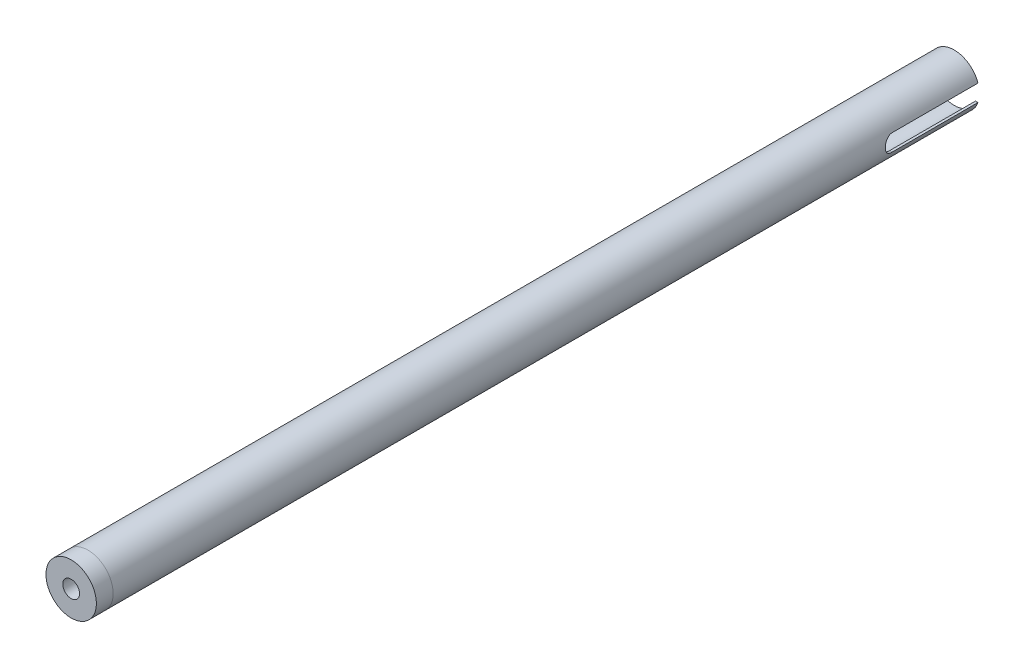
ISO-10303-21;
HEADER;
FILE_DESCRIPTION(('STEP AP214'),'2;1');
FILE_NAME('part.step','',(''),(''),'','','');
FILE_SCHEMA(('AUTOMOTIVE_DESIGN { 1 0 10303 214 1 1 1 1 }'));
ENDSEC;
DATA;
#1=APPLICATION_CONTEXT('core data for automotive mechanical design processes');
#2=APPLICATION_PROTOCOL_DEFINITION('international standard','automotive_design',2000,#1);
#3=PRODUCT_CONTEXT('',#1,'mechanical');
#4=PRODUCT('Part','Part','',(#3));
#5=PRODUCT_RELATED_PRODUCT_CATEGORY('part','',(#4));
#6=PRODUCT_DEFINITION_FORMATION('','',#4);
#7=PRODUCT_DEFINITION_CONTEXT('part definition',#1,'design');
#8=PRODUCT_DEFINITION('design','',#6,#7);
#9=PRODUCT_DEFINITION_SHAPE('','',#8);
#10=(LENGTH_UNIT() NAMED_UNIT(*) SI_UNIT(.MILLI.,.METRE.));
#11=(NAMED_UNIT(*) PLANE_ANGLE_UNIT() SI_UNIT($,.RADIAN.));
#12=(NAMED_UNIT(*) SI_UNIT($,.STERADIAN.) SOLID_ANGLE_UNIT());
#13=UNCERTAINTY_MEASURE_WITH_UNIT(LENGTH_MEASURE(1.E-05),#10,'distance_accuracy_value','');
#14=(GEOMETRIC_REPRESENTATION_CONTEXT(3) GLOBAL_UNCERTAINTY_ASSIGNED_CONTEXT((#13)) GLOBAL_UNIT_ASSIGNED_CONTEXT((#10,
#11,#12)) REPRESENTATION_CONTEXT('',''));
#15=CARTESIAN_POINT('',(0.,0.,0.));
#16=DIRECTION('',(0.,0.,1.));
#17=DIRECTION('',(1.,0.,0.));
#18=AXIS2_PLACEMENT_3D('',#15,#16,#17);
#19=CARTESIAN_POINT('',(0.,0.,-333.573444203243));
#20=DIRECTION('',(0.,0.,1.));
#21=DIRECTION('',(1.,0.,0.));
#22=AXIS2_PLACEMENT_3D('',#19,#20,#21);
#23=CYLINDRICAL_SURFACE('',#22,9.525);
#24=CARTESIAN_POINT('',(0.,0.,-6.35));
#25=DIRECTION('',(0.,0.,1.));
#26=DIRECTION('',(1.,0.,0.));
#27=AXIS2_PLACEMENT_3D('',#24,#25,#26);
#28=CIRCLE('',#27,9.525);
#29=CARTESIAN_POINT('',(9.525,0.,-6.35));
#30=VERTEX_POINT('',#29);
#31=EDGE_CURVE('E169',#30,#30,#28,.T.);
#32=ORIENTED_EDGE('',*,*,#31,.F.);
#33=EDGE_LOOP('',(#32));
#34=FACE_BOUND('',#33,.T.);
#35=CARTESIAN_POINT('',(-8.98025612106915,3.175,-301.188444203243));
#36=CARTESIAN_POINT('',(-8.98024230233901,3.17501142134308,-301.101818099907));
#37=CARTESIAN_POINT('',(-8.98150922759707,3.17145501317748,-301.015199717431));
#38=CARTESIAN_POINT('',(-8.98650170400112,3.1572955094353,-300.842634902606));
#39=CARTESIAN_POINT('',(-8.99022659113085,3.14669431699565,-300.75668829512));
#40=CARTESIAN_POINT('',(-9.00001740508998,3.11857670914846,-300.586334053955));
#41=CARTESIAN_POINT('',(-9.00607621805003,3.10108130380329,-300.501922552147));
#42=CARTESIAN_POINT('',(-9.02033586435303,3.05935434973544,-300.334987750812));
#43=CARTESIAN_POINT('',(-9.02853677497232,3.03512255799513,-300.252464519521));
#44=CARTESIAN_POINT('',(-9.05598792154067,2.95264369348964,-300.008665896244));
#45=CARTESIAN_POINT('',(-9.07810200713863,2.88457148458963,-299.85091231192));
#46=CARTESIAN_POINT('',(-9.12745136023601,2.72437908867645,-299.549035793431));
#47=CARTESIAN_POINT('',(-9.15468995097455,2.63224328129308,-299.404921796202));
#48=CARTESIAN_POINT('',(-9.21240416673121,2.42269155952414,-299.128768936378));
#49=CARTESIAN_POINT('',(-9.24296008478943,2.30449853156512,-298.997335354516));
#50=CARTESIAN_POINT('',(-9.30318902123142,2.04784031127145,-298.755740058179));
#51=CARTESIAN_POINT('',(-9.33286185998227,1.90937102786996,-298.645582646947));
#52=CARTESIAN_POINT('',(-9.38892492365178,1.61159672697579,-298.446865635459));
#53=CARTESIAN_POINT('',(-9.41520772598947,1.45183792838571,-298.358953449449));
#54=CARTESIAN_POINT('',(-9.46054712430069,1.11883883316163,-298.211548723379));
#55=CARTESIAN_POINT('',(-9.47961052807859,0.945611424033776,-298.152029395377));
#56=CARTESIAN_POINT('',(-9.50410661247238,0.642992499572378,-298.076550630882));
#57=CARTESIAN_POINT('',(-9.51189798251809,0.515662964136021,-298.052932658839));
#58=CARTESIAN_POINT('',(-9.51973491912187,0.323120458247705,-298.029266392665));
#59=CARTESIAN_POINT('',(-9.52170555244691,0.258670486244993,-298.023337745048));
#60=CARTESIAN_POINT('',(-9.52433958502699,0.12948493034666,-298.015425120382));
#61=CARTESIAN_POINT('',(-9.5250026318504,0.0647492741617722,-298.013442206817));
#62=CARTESIAN_POINT('',(-9.525,0.,-298.013444203243));
#63=B_SPLINE_CURVE_WITH_KNOTS('',3,(#35,#36,#37,#38,#39,#40,#41,#42,#43,#44,#45,#46,#47,#48,#49,
#50,#51,#52,#53,#54,#55,#56,#57,#58,#59,#60,#61,#62),.UNSPECIFIED.,.F.,.F.,(4,2,2,2,2,2,2,2,2,2,
2,2,2,4),(0.,0.259783027985017,0.519495904525387,0.77842335407941,1.0373601457496,
1.5544837070914,2.07194378605916,2.60765740005749,3.14347925237348,3.69345572792675,
4.24291228331228,4.63105001394513,4.82518498412948,5.01937227204625),.UNSPECIFIED.);
#64=CARTESIAN_POINT('',(-8.98025612106915,3.175,-301.188444203243));
#65=VERTEX_POINT('',#64);
#66=CARTESIAN_POINT('',(-9.525,0.,-298.013444203243));
#67=VERTEX_POINT('',#66);
#68=EDGE_CURVE('E196',#65,#67,#63,.T.);
#69=ORIENTED_EDGE('',*,*,#68,.T.);
#70=CARTESIAN_POINT('',(-9.525,0.,-298.013444203243));
#71=CARTESIAN_POINT('',(-9.52501110102584,-0.0867614879611047,-298.013433098206));
#72=CARTESIAN_POINT('',(-9.52381482114642,-0.173516026970688,-298.017000309863));
#73=CARTESIAN_POINT('',(-9.51909010104991,-0.346361025979108,-298.031205148445));
#74=CARTESIAN_POINT('',(-9.51556219632442,-0.432451633867625,-298.041841151922));
#75=CARTESIAN_POINT('',(-9.50626969526085,-0.603121388983429,-298.070058143435));
#76=CARTESIAN_POINT('',(-9.50051134567603,-0.687704073408636,-298.087619737604));
#77=CARTESIAN_POINT('',(-9.48692170416637,-0.854983898510564,-298.129511058242));
#78=CARTESIAN_POINT('',(-9.47909035815865,-0.937680989932468,-298.153840961292));
#79=CARTESIAN_POINT('',(-9.45278540829331,-1.18202731628102,-298.23667535423));
#80=CARTESIAN_POINT('',(-9.43148823554423,-1.3401498669332,-298.305061035576));
#81=CARTESIAN_POINT('',(-9.38354405256208,-1.64264414222568,-298.465987561352));
#82=CARTESIAN_POINT('',(-9.35689419571071,-1.78700848960572,-298.558541266505));
#83=CARTESIAN_POINT('',(-9.30002401422068,-2.06291632995426,-298.76853469471));
#84=CARTESIAN_POINT('',(-9.26971861159364,-2.19392359690272,-298.88665698013));
#85=CARTESIAN_POINT('',(-9.20941732427213,-2.43468689521897,-299.142994956965));
#86=CARTESIAN_POINT('',(-9.1794215361322,-2.54443647619592,-299.281216725123));
#87=CARTESIAN_POINT('',(-9.122187697517,-2.74268087840456,-299.57872470417));
#88=CARTESIAN_POINT('',(-9.09505529775998,-2.83046425019683,-299.738506842244));
#89=CARTESIAN_POINT('',(-9.04794936227173,-2.97762337182932,-300.071551164249));
#90=CARTESIAN_POINT('',(-9.0279682579705,-3.03702917747986,-300.244798859057));
#91=CARTESIAN_POINT('',(-9.00226999890487,-3.1122125650425,-300.547085893052));
#92=CARTESIAN_POINT('',(-8.99408207355733,-3.13569679171672,-300.674048214479));
#93=CARTESIAN_POINT('',(-8.98304472933549,-3.16711304593222,-300.930125386248));
#94=CARTESIAN_POINT('',(-8.98019613476149,-3.17504267212105,-301.05924056585));
#95=CARTESIAN_POINT('',(-8.98025612106915,-3.175,-301.188444203243));
#96=B_SPLINE_CURVE_WITH_KNOTS('',3,(#70,#71,#72,#73,#74,#75,#76,#77,#78,#79,#80,#81,#82,#83,#84,
#85,#86,#87,#88,#89,#90,#91,#92,#93,#94,#95),.UNSPECIFIED.,.F.,.F.,(4,2,2,2,2,2,2,2,2,2,2,2,4),
(0.,0.260191091827307,0.52032244773723,0.779730467212497,1.03914525511038,1.55731822615721,
2.07576750062865,2.61028978360817,3.14497400776474,3.69521752133766,4.24487695078963,
4.63199348452988,5.01916977744542),.UNSPECIFIED.);
#97=CARTESIAN_POINT('',(-8.98025612106916,-3.175,-301.188444203243));
#98=VERTEX_POINT('',#97);
#99=EDGE_CURVE('E148',#67,#98,#96,.T.);
#100=ORIENTED_EDGE('',*,*,#99,.T.);
#101=DIRECTION('',(0.,0.,-1.));
#102=VECTOR('',#101,1.);
#103=CARTESIAN_POINT('',(-8.98025612106916,-3.175,-298.013444203243));
#104=LINE('',#103,#102);
#105=CARTESIAN_POINT('',(-8.98025612106916,-3.175,-333.573444203243));
#106=VERTEX_POINT('',#105);
#107=EDGE_CURVE('E143',#98,#106,#104,.T.);
#108=ORIENTED_EDGE('',*,*,#107,.T.);
#109=CARTESIAN_POINT('',(0.,0.,-333.573444203243));
#110=DIRECTION('',(0.,0.,1.));
#111=DIRECTION('',(1.,0.,0.));
#112=AXIS2_PLACEMENT_3D('',#109,#110,#111);
#113=CIRCLE('',#112,9.525);
#114=CARTESIAN_POINT('',(8.98025612106915,-3.175,-333.573444203243));
#115=VERTEX_POINT('',#114);
#116=EDGE_CURVE('E146',#106,#115,#113,.T.);
#117=ORIENTED_EDGE('',*,*,#116,.T.);
#118=DIRECTION('',(0.,0.,-1.));
#119=VECTOR('',#118,1.);
#120=CARTESIAN_POINT('',(8.98025612106915,-3.175,-298.013444203243));
#121=LINE('',#120,#119);
#122=CARTESIAN_POINT('',(8.98025612106915,-3.175,-301.188444203243));
#123=VERTEX_POINT('',#122);
#124=EDGE_CURVE('E429',#123,#115,#121,.T.);
#125=ORIENTED_EDGE('',*,*,#124,.F.);
#126=CARTESIAN_POINT('',(8.98025612106915,-3.175,-301.188444203243));
#127=CARTESIAN_POINT('',(8.98024230233901,-3.17501142134308,-301.101818099907));
#128=CARTESIAN_POINT('',(8.98150922759707,-3.17145501317748,-301.015199717431));
#129=CARTESIAN_POINT('',(8.98650170400112,-3.1572955094353,-300.842634902606));
#130=CARTESIAN_POINT('',(8.99022659113085,-3.14669431699565,-300.75668829512));
#131=CARTESIAN_POINT('',(9.00001740508998,-3.11857670914846,-300.586334053955));
#132=CARTESIAN_POINT('',(9.00607621805003,-3.10108130380329,-300.501922552147));
#133=CARTESIAN_POINT('',(9.02033586435303,-3.05935434973544,-300.334987750812));
#134=CARTESIAN_POINT('',(9.02853677497232,-3.03512255799513,-300.252464519521));
#135=CARTESIAN_POINT('',(9.05598792154067,-2.95264369348964,-300.008665896244));
#136=CARTESIAN_POINT('',(9.07810200713863,-2.88457148458963,-299.85091231192));
#137=CARTESIAN_POINT('',(9.12745136023601,-2.72437908867645,-299.549035793431));
#138=CARTESIAN_POINT('',(9.15468995097455,-2.63224328129308,-299.404921796202));
#139=CARTESIAN_POINT('',(9.21240416673121,-2.42269155952414,-299.128768936378));
#140=CARTESIAN_POINT('',(9.24296008478943,-2.30449853156512,-298.997335354516));
#141=CARTESIAN_POINT('',(9.30318902123142,-2.04784031127145,-298.755740058179));
#142=CARTESIAN_POINT('',(9.33286185998227,-1.90937102786996,-298.645582646947));
#143=CARTESIAN_POINT('',(9.38892492365178,-1.61159672697579,-298.446865635459));
#144=CARTESIAN_POINT('',(9.41520772598947,-1.45183792838571,-298.358953449449));
#145=CARTESIAN_POINT('',(9.46054712430069,-1.11883883316163,-298.211548723379));
#146=CARTESIAN_POINT('',(9.47961052807859,-0.945611424033776,-298.152029395377));
#147=CARTESIAN_POINT('',(9.50410661247238,-0.642992499572378,-298.076550630882));
#148=CARTESIAN_POINT('',(9.51189798251809,-0.515662964136021,-298.052932658839));
#149=CARTESIAN_POINT('',(9.51973491912187,-0.323120458247705,-298.029266392665));
#150=CARTESIAN_POINT('',(9.52170555244691,-0.258670486244993,-298.023337745048));
#151=CARTESIAN_POINT('',(9.52433958502699,-0.12948493034666,-298.015425120382));
#152=CARTESIAN_POINT('',(9.5250026318504,-0.0647492741617722,-298.013442206817));
#153=CARTESIAN_POINT('',(9.525,0.,-298.013444203243));
#154=B_SPLINE_CURVE_WITH_KNOTS('',3,(#126,#127,#128,#129,#130,#131,#132,#133,#134,#135,#136,
#137,#138,#139,#140,#141,#142,#143,#144,#145,#146,#147,#148,#149,#150,#151,#152,#153),
.UNSPECIFIED.,.F.,.F.,(4,2,2,2,2,2,2,2,2,2,2,2,2,4),(0.,0.259783027985017,0.519495904525387,
0.77842335407941,1.0373601457496,1.5544837070914,2.07194378605916,2.60765740005749,
3.14347925237348,3.69345572792675,4.24291228331228,4.63105001394513,4.82518498412948,
5.01937227204625),.UNSPECIFIED.);
#155=CARTESIAN_POINT('',(9.525,0.,-298.013444203243));
#156=VERTEX_POINT('',#155);
#157=EDGE_CURVE('E89',#123,#156,#154,.T.);
#158=ORIENTED_EDGE('',*,*,#157,.T.);
#159=CARTESIAN_POINT('',(9.525,0.,-298.013444203243));
#160=CARTESIAN_POINT('',(9.52501110102584,0.0867614879611047,-298.013433098206));
#161=CARTESIAN_POINT('',(9.52381482114642,0.173516026970688,-298.017000309863));
#162=CARTESIAN_POINT('',(9.51909010104991,0.346361025979108,-298.031205148445));
#163=CARTESIAN_POINT('',(9.51556219632442,0.432451633867625,-298.041841151922));
#164=CARTESIAN_POINT('',(9.50626969526085,0.603121388983429,-298.070058143435));
#165=CARTESIAN_POINT('',(9.50051134567603,0.687704073408636,-298.087619737604));
#166=CARTESIAN_POINT('',(9.48692170416637,0.854983898510564,-298.129511058242));
#167=CARTESIAN_POINT('',(9.47909035815865,0.937680989932468,-298.153840961292));
#168=CARTESIAN_POINT('',(9.45278540829331,1.18202731628102,-298.23667535423));
#169=CARTESIAN_POINT('',(9.43148823554423,1.3401498669332,-298.305061035576));
#170=CARTESIAN_POINT('',(9.38354405256208,1.64264414222568,-298.465987561352));
#171=CARTESIAN_POINT('',(9.35689419571071,1.78700848960572,-298.558541266505));
#172=CARTESIAN_POINT('',(9.30002401422068,2.06291632995426,-298.76853469471));
#173=CARTESIAN_POINT('',(9.26971861159364,2.19392359690272,-298.88665698013));
#174=CARTESIAN_POINT('',(9.20941732427213,2.43468689521897,-299.142994956965));
#175=CARTESIAN_POINT('',(9.1794215361322,2.54443647619592,-299.281216725123));
#176=CARTESIAN_POINT('',(9.122187697517,2.74268087840456,-299.57872470417));
#177=CARTESIAN_POINT('',(9.09505529775998,2.83046425019683,-299.738506842244));
#178=CARTESIAN_POINT('',(9.04794936227173,2.97762337182932,-300.071551164249));
#179=CARTESIAN_POINT('',(9.0279682579705,3.03702917747986,-300.244798859057));
#180=CARTESIAN_POINT('',(9.00226999890487,3.1122125650425,-300.547085893052));
#181=CARTESIAN_POINT('',(8.99408207355733,3.13569679171672,-300.674048214479));
#182=CARTESIAN_POINT('',(8.98304472933549,3.16711304593222,-300.930125386248));
#183=CARTESIAN_POINT('',(8.98019613476149,3.17504267212105,-301.05924056585));
#184=CARTESIAN_POINT('',(8.98025612106915,3.175,-301.188444203243));
#185=B_SPLINE_CURVE_WITH_KNOTS('',3,(#159,#160,#161,#162,#163,#164,#165,#166,#167,#168,#169,
#170,#171,#172,#173,#174,#175,#176,#177,#178,#179,#180,#181,#182,#183,#184),.UNSPECIFIED.,.F.,
.F.,(4,2,2,2,2,2,2,2,2,2,2,2,4),(0.,0.260191091827307,0.52032244773723,0.779730467212497,
1.03914525511038,1.55731822615721,2.07576750062865,2.61028978360817,3.14497400776474,
3.69521752133766,4.24487695078963,4.63199348452988,5.01916977744542),.UNSPECIFIED.);
#186=CARTESIAN_POINT('',(8.98025612106915,3.175,-301.188444203243));
#187=VERTEX_POINT('',#186);
#188=EDGE_CURVE('E75',#156,#187,#185,.T.);
#189=ORIENTED_EDGE('',*,*,#188,.T.);
#190=DIRECTION('',(0.,0.,-1.));
#191=VECTOR('',#190,1.);
#192=CARTESIAN_POINT('',(8.98025612106915,3.175,-298.013444203243));
#193=LINE('',#192,#191);
#194=CARTESIAN_POINT('',(8.98025612106915,3.175,-333.573444203243));
#195=VERTEX_POINT('',#194);
#196=EDGE_CURVE('E162',#187,#195,#193,.T.);
#197=ORIENTED_EDGE('',*,*,#196,.T.);
#198=CARTESIAN_POINT('',(-8.98025612106915,3.175,-333.573444203243));
#199=VERTEX_POINT('',#198);
#200=EDGE_CURVE('E168',#195,#199,#113,.T.);
#201=ORIENTED_EDGE('',*,*,#200,.T.);
#202=DIRECTION('',(0.,0.,-1.));
#203=VECTOR('',#202,1.);
#204=CARTESIAN_POINT('',(-8.98025612106915,3.175,-298.013444203243));
#205=LINE('',#204,#203);
#206=EDGE_CURVE('E422',#65,#199,#205,.T.);
#207=ORIENTED_EDGE('',*,*,#206,.F.);
#208=EDGE_LOOP('',(#69,#100,#108,#117,#125,#158,#189,#197,#201,#207));
#209=FACE_BOUND('',#208,.T.);
#210=ADVANCED_FACE('F65',(#34,#209),#23,.T.);
#211=CARTESIAN_POINT('',(0.,0.,-333.573444203243));
#212=DIRECTION('',(0.,0.,1.));
#213=DIRECTION('',(1.,0.,0.));
#214=AXIS2_PLACEMENT_3D('',#211,#212,#213);
#215=PLANE('',#214);
#216=DIRECTION('',(1.,0.,0.));
#217=VECTOR('',#216,1.);
#218=CARTESIAN_POINT('',(0.,-3.175,-333.573444203243));
#219=LINE('',#218,#217);
#220=CARTESIAN_POINT('',(-8.03118117091129,-3.175,-333.573444203243));
#221=VERTEX_POINT('',#220);
#222=EDGE_CURVE('E155',#106,#221,#219,.T.);
#223=ORIENTED_EDGE('',*,*,#222,.T.);
#224=CARTESIAN_POINT('',(0.,0.,-333.573444203243));
#225=DIRECTION('',(0.,0.,1.));
#226=DIRECTION('',(1.,0.,0.));
#227=AXIS2_PLACEMENT_3D('',#224,#225,#226);
#228=CIRCLE('',#227,8.636);
#229=CARTESIAN_POINT('',(8.03118117091129,-3.175,-333.573444203243));
#230=VERTEX_POINT('',#229);
#231=EDGE_CURVE('E277',#221,#230,#228,.T.);
#232=ORIENTED_EDGE('',*,*,#231,.T.);
#233=DIRECTION('',(1.,0.,0.));
#234=VECTOR('',#233,1.);
#235=CARTESIAN_POINT('',(0.,-3.175,-333.573444203243));
#236=LINE('',#235,#234);
#237=EDGE_CURVE('E167',#230,#115,#236,.T.);
#238=ORIENTED_EDGE('',*,*,#237,.T.);
#239=ORIENTED_EDGE('',*,*,#116,.F.);
#240=EDGE_LOOP('',(#223,#232,#238,#239));
#241=FACE_BOUND('',#240,.T.);
#242=ADVANCED_FACE('F165',(#241),#215,.F.);
#243=CARTESIAN_POINT('',(0.,0.,-333.573444203243));
#244=DIRECTION('',(0.,0.,1.));
#245=DIRECTION('',(1.,0.,0.));
#246=AXIS2_PLACEMENT_3D('',#243,#244,#245);
#247=CYLINDRICAL_SURFACE('',#246,8.636);
#248=CARTESIAN_POINT('',(0.,0.,-6.35));
#249=DIRECTION('',(0.,0.,1.));
#250=DIRECTION('',(1.,0.,0.));
#251=AXIS2_PLACEMENT_3D('',#248,#249,#250);
#252=CIRCLE('',#251,8.636);
#253=CARTESIAN_POINT('',(8.636,0.,-6.35));
#254=VERTEX_POINT('',#253);
#255=EDGE_CURVE('E151',#254,#254,#252,.T.);
#256=ORIENTED_EDGE('',*,*,#255,.T.);
#257=EDGE_LOOP('',(#256));
#258=FACE_BOUND('',#257,.T.);
#259=DIRECTION('',(0.,0.,-1.));
#260=VECTOR('',#259,1.);
#261=CARTESIAN_POINT('',(-8.03118117091129,-3.175,-298.013444203243));
#262=LINE('',#261,#260);
#263=CARTESIAN_POINT('',(-8.03118117091129,-3.175,-301.188444203243));
#264=VERTEX_POINT('',#263);
#265=EDGE_CURVE('E152',#264,#221,#262,.T.);
#266=ORIENTED_EDGE('',*,*,#265,.F.);
#267=CARTESIAN_POINT('',(-8.03118117091129,-3.175,-301.188444203243));
#268=CARTESIAN_POINT('',(-8.03116550357192,-3.17501203663229,-301.102409235127));
#269=CARTESIAN_POINT('',(-8.03256328665432,-3.17150327993899,-301.016382882598));
#270=CARTESIAN_POINT('',(-8.03806891362409,-3.15753809299539,-300.845010312129));
#271=CARTESIAN_POINT('',(-8.04217588089716,-3.14708391007799,-300.759663883223));
#272=CARTESIAN_POINT('',(-8.05296421917626,-3.11937037021479,-300.590554749007));
#273=CARTESIAN_POINT('',(-8.05963650808001,-3.10213501593152,-300.506787538065));
#274=CARTESIAN_POINT('',(-8.07533202922414,-3.06104389654164,-300.341138575297));
#275=CARTESIAN_POINT('',(-8.08435537430867,-3.0371878136549,-300.259256914178));
#276=CARTESIAN_POINT('',(-8.11453837074661,-2.95603278100127,-300.017404756933));
#277=CARTESIAN_POINT('',(-8.13883087950844,-2.88909903597752,-299.860938119357));
#278=CARTESIAN_POINT('',(-8.19300406693486,-2.73167948818753,-299.561403130232));
#279=CARTESIAN_POINT('',(-8.22288931448619,-2.64117440539563,-299.418345877676));
#280=CARTESIAN_POINT('',(-8.28646461334555,-2.43457537576577,-299.142875468438));
#281=CARTESIAN_POINT('',(-8.32026315150128,-2.31754645569601,-299.011187096351));
#282=CARTESIAN_POINT('',(-8.38695072719909,-2.06320558041455,-298.768798917957));
#283=CARTESIAN_POINT('',(-8.41983956911545,-1.9258893021522,-298.658103596587));
#284=CARTESIAN_POINT('',(-8.48230406273647,-1.62932475427477,-298.457322481637));
#285=CARTESIAN_POINT('',(-8.5117351959247,-1.46950375402871,-298.368034128131));
#286=CARTESIAN_POINT('',(-8.56262575627031,-1.13591027783608,-298.217971975168));
#287=CARTESIAN_POINT('',(-8.58409342507971,-0.962152453429224,-298.157168678348));
#288=CARTESIAN_POINT('',(-8.61197450421745,-0.656412542712576,-298.079244312698));
#289=CARTESIAN_POINT('',(-8.62092967235125,-0.526538210349248,-298.05462852836));
#290=CARTESIAN_POINT('',(-8.62994176115801,-0.330020976938503,-298.029951196644));
#291=CARTESIAN_POINT('',(-8.63220903333296,-0.264206342476348,-298.023766457493));
#292=CARTESIAN_POINT('',(-8.63523992352765,-0.132266265743974,-298.015511242048));
#293=CARTESIAN_POINT('',(-8.6360031097792,-0.0661407396870678,-298.013441947145));
#294=CARTESIAN_POINT('',(-8.636,0.,-298.013444203243));
#295=B_SPLINE_CURVE_WITH_KNOTS('',3,(#267,#268,#269,#270,#271,#272,#273,#274,#275,#276,#277,
#278,#279,#280,#281,#282,#283,#284,#285,#286,#287,#288,#289,#290,#291,#292,#293,#294),
.UNSPECIFIED.,.F.,.F.,(4,2,2,2,2,2,2,2,2,2,2,2,2,4),(0.,0.258007583993685,0.515931725057005,
0.77295101340558,1.02998264023838,1.54317615093284,2.05679075055082,2.59254838663377,
3.128420352877,3.68191422398167,4.23483365719865,4.63113823379684,4.82943692106889,
5.02779252437178),.UNSPECIFIED.);
#296=CARTESIAN_POINT('',(-8.636,0.,-298.013444203243));
#297=VERTEX_POINT('',#296);
#298=EDGE_CURVE('E223',#264,#297,#295,.T.);
#299=ORIENTED_EDGE('',*,*,#298,.T.);
#300=CARTESIAN_POINT('',(-8.636,0.,-298.013444203243));
#301=CARTESIAN_POINT('',(-8.63601200177566,0.0862340545028661,-298.01343262952));
#302=CARTESIAN_POINT('',(-8.63470866649585,0.172460638964016,-298.01695716954));
#303=CARTESIAN_POINT('',(-8.62956076290727,0.344245368623961,-298.03098859917));
#304=CARTESIAN_POINT('',(-8.62571686385256,0.429803683858972,-298.041493649926));
#305=CARTESIAN_POINT('',(-8.61559314175803,0.599377201936824,-298.069352403981));
#306=CARTESIAN_POINT('',(-8.60932102288695,0.683396413719317,-298.086684449837));
#307=CARTESIAN_POINT('',(-8.5945171663722,0.849553539449469,-298.128015673113));
#308=CARTESIAN_POINT('',(-8.58598535382315,0.931691390934831,-298.152015071546));
#309=CARTESIAN_POINT('',(-8.55732464851214,1.17435074221828,-298.233689252983));
#310=CARTESIAN_POINT('',(-8.53411500636261,1.33136171263576,-298.30108057395));
#311=CARTESIAN_POINT('',(-8.48180653117632,1.63181198358794,-298.459572283959));
#312=CARTESIAN_POINT('',(-8.45270389942466,1.77524244193608,-298.550687976996));
#313=CARTESIAN_POINT('',(-8.39029834803106,2.05036661398532,-298.757941094675));
#314=CARTESIAN_POINT('',(-8.35688032192871,2.1814347411356,-298.874875462267));
#315=CARTESIAN_POINT('',(-8.29018507770489,2.42260670191496,-299.128764448724));
#316=CARTESIAN_POINT('',(-8.25690791509208,2.53270290926749,-299.265726318554));
#317=CARTESIAN_POINT('',(-8.19291826363247,2.73277128594141,-299.561891407379));
#318=CARTESIAN_POINT('',(-8.16234475412034,2.82185641770732,-299.721726496816));
#319=CARTESIAN_POINT('',(-8.10906121054024,2.97153048258984,-300.055321840318));
#320=CARTESIAN_POINT('',(-8.08634169503735,3.03215380703845,-300.229064989987));
#321=CARTESIAN_POINT('',(-8.05677760160867,3.10966172606007,-300.534333624799));
#322=CARTESIAN_POINT('',(-8.04725077861386,3.13409804308654,-300.663714344005));
#323=CARTESIAN_POINT('',(-8.03764862425496,3.15860280233701,-300.859521469846));
#324=CARTESIAN_POINT('',(-8.0352292163598,3.16474613160121,-300.925114226152));
#325=CARTESIAN_POINT('',(-8.03199317651195,3.17294655384153,-301.056614178542));
#326=CARTESIAN_POINT('',(-8.03117703985816,3.17500238406813,-301.122521465492));
#327=CARTESIAN_POINT('',(-8.03118117091129,3.175,-301.188444203243));
#328=B_SPLINE_CURVE_WITH_KNOTS('',3,(#300,#301,#302,#303,#304,#305,#306,#307,#308,#309,#310,
#311,#312,#313,#314,#315,#316,#317,#318,#319,#320,#321,#322,#323,#324,#325,#326,#327),
.UNSPECIFIED.,.F.,.F.,(4,2,2,2,2,2,2,2,2,2,2,2,2,4),(0.,0.258607684277239,0.517147271349144,
0.774873208333404,1.03260768960759,1.54734347080466,2.06241212125685,2.59642224394461,
3.13062618611954,3.6844391606936,4.23758121159796,4.63245186558856,4.83009172977022,
5.0277926412787),.UNSPECIFIED.);
#329=CARTESIAN_POINT('',(-8.03118117091129,3.175,-301.188444203243));
#330=VERTEX_POINT('',#329);
#331=EDGE_CURVE('E188',#297,#330,#328,.T.);
#332=ORIENTED_EDGE('',*,*,#331,.T.);
#333=DIRECTION('',(0.,0.,-1.));
#334=VECTOR('',#333,1.);
#335=CARTESIAN_POINT('',(-8.03118117091129,3.175,-298.013444203243));
#336=LINE('',#335,#334);
#337=CARTESIAN_POINT('',(-8.03118117091129,3.175,-333.573444203243));
#338=VERTEX_POINT('',#337);
#339=EDGE_CURVE('E419',#330,#338,#336,.T.);
#340=ORIENTED_EDGE('',*,*,#339,.T.);
#341=CARTESIAN_POINT('',(8.03118117091129,3.175,-333.573444203243));
#342=VERTEX_POINT('',#341);
#343=EDGE_CURVE('E174',#342,#338,#228,.T.);
#344=ORIENTED_EDGE('',*,*,#343,.F.);
#345=DIRECTION('',(0.,0.,-1.));
#346=VECTOR('',#345,1.);
#347=CARTESIAN_POINT('',(8.03118117091129,3.175,-298.013444203243));
#348=LINE('',#347,#346);
#349=CARTESIAN_POINT('',(8.03118117091129,3.175,-301.188444203243));
#350=VERTEX_POINT('',#349);
#351=EDGE_CURVE('E271',#350,#342,#348,.T.);
#352=ORIENTED_EDGE('',*,*,#351,.F.);
#353=CARTESIAN_POINT('',(8.03118117091129,3.175,-301.188444203243));
#354=CARTESIAN_POINT('',(8.03116550357192,3.17501203663229,-301.102409235127));
#355=CARTESIAN_POINT('',(8.03256328665432,3.17150327993899,-301.016382882598));
#356=CARTESIAN_POINT('',(8.03806891362409,3.15753809299539,-300.845010312129));
#357=CARTESIAN_POINT('',(8.04217588089716,3.14708391007799,-300.759663883223));
#358=CARTESIAN_POINT('',(8.05296421917626,3.11937037021479,-300.590554749007));
#359=CARTESIAN_POINT('',(8.05963650808001,3.10213501593152,-300.506787538065));
#360=CARTESIAN_POINT('',(8.07533202922414,3.06104389654164,-300.341138575297));
#361=CARTESIAN_POINT('',(8.08435537430867,3.0371878136549,-300.259256914178));
#362=CARTESIAN_POINT('',(8.11453837074661,2.95603278100127,-300.017404756933));
#363=CARTESIAN_POINT('',(8.13883087950844,2.88909903597752,-299.860938119357));
#364=CARTESIAN_POINT('',(8.19300406693486,2.73167948818753,-299.561403130232));
#365=CARTESIAN_POINT('',(8.22288931448619,2.64117440539563,-299.418345877676));
#366=CARTESIAN_POINT('',(8.28646461334555,2.43457537576577,-299.142875468438));
#367=CARTESIAN_POINT('',(8.32026315150128,2.31754645569601,-299.011187096351));
#368=CARTESIAN_POINT('',(8.38695072719909,2.06320558041455,-298.768798917957));
#369=CARTESIAN_POINT('',(8.41983956911545,1.9258893021522,-298.658103596587));
#370=CARTESIAN_POINT('',(8.48230406273647,1.62932475427477,-298.457322481637));
#371=CARTESIAN_POINT('',(8.5117351959247,1.46950375402871,-298.368034128131));
#372=CARTESIAN_POINT('',(8.56262575627031,1.13591027783608,-298.217971975168));
#373=CARTESIAN_POINT('',(8.58409342507971,0.962152453429224,-298.157168678348));
#374=CARTESIAN_POINT('',(8.61197450421745,0.656412542712576,-298.079244312698));
#375=CARTESIAN_POINT('',(8.62092967235125,0.526538210349248,-298.05462852836));
#376=CARTESIAN_POINT('',(8.62994176115801,0.330020976938503,-298.029951196644));
#377=CARTESIAN_POINT('',(8.63220903333296,0.264206342476348,-298.023766457493));
#378=CARTESIAN_POINT('',(8.63523992352765,0.132266265743974,-298.015511242048));
#379=CARTESIAN_POINT('',(8.6360031097792,0.0661407396870678,-298.013441947145));
#380=CARTESIAN_POINT('',(8.636,0.,-298.013444203243));
#381=B_SPLINE_CURVE_WITH_KNOTS('',3,(#353,#354,#355,#356,#357,#358,#359,#360,#361,#362,#363,
#364,#365,#366,#367,#368,#369,#370,#371,#372,#373,#374,#375,#376,#377,#378,#379,#380),
.UNSPECIFIED.,.F.,.F.,(4,2,2,2,2,2,2,2,2,2,2,2,2,4),(0.,0.258007583993685,0.515931725057005,
0.77295101340558,1.02998264023838,1.54317615093284,2.05679075055082,2.59254838663377,
3.128420352877,3.68191422398167,4.23483365719865,4.63113823379684,4.82943692106889,
5.02779252437178),.UNSPECIFIED.);
#382=CARTESIAN_POINT('',(8.636,0.,-298.013444203243));
#383=VERTEX_POINT('',#382);
#384=EDGE_CURVE('E13',#350,#383,#381,.T.);
#385=ORIENTED_EDGE('',*,*,#384,.T.);
#386=CARTESIAN_POINT('',(8.636,0.,-298.013444203243));
#387=CARTESIAN_POINT('',(8.63601200177566,-0.0862340545028661,-298.01343262952));
#388=CARTESIAN_POINT('',(8.63470866649585,-0.172460638964016,-298.01695716954));
#389=CARTESIAN_POINT('',(8.62956076290727,-0.344245368623961,-298.03098859917));
#390=CARTESIAN_POINT('',(8.62571686385256,-0.429803683858972,-298.041493649926));
#391=CARTESIAN_POINT('',(8.61559314175803,-0.599377201936824,-298.069352403981));
#392=CARTESIAN_POINT('',(8.60932102288695,-0.683396413719317,-298.086684449837));
#393=CARTESIAN_POINT('',(8.5945171663722,-0.849553539449469,-298.128015673113));
#394=CARTESIAN_POINT('',(8.58598535382315,-0.931691390934831,-298.152015071546));
#395=CARTESIAN_POINT('',(8.55732464851214,-1.17435074221828,-298.233689252983));
#396=CARTESIAN_POINT('',(8.53411500636261,-1.33136171263576,-298.30108057395));
#397=CARTESIAN_POINT('',(8.48180653117632,-1.63181198358794,-298.459572283959));
#398=CARTESIAN_POINT('',(8.45270389942466,-1.77524244193608,-298.550687976996));
#399=CARTESIAN_POINT('',(8.39029834803106,-2.05036661398532,-298.757941094675));
#400=CARTESIAN_POINT('',(8.35688032192871,-2.1814347411356,-298.874875462267));
#401=CARTESIAN_POINT('',(8.29018507770489,-2.42260670191496,-299.128764448724));
#402=CARTESIAN_POINT('',(8.25690791509208,-2.53270290926749,-299.265726318554));
#403=CARTESIAN_POINT('',(8.19291826363247,-2.73277128594141,-299.561891407379));
#404=CARTESIAN_POINT('',(8.16234475412034,-2.82185641770732,-299.721726496816));
#405=CARTESIAN_POINT('',(8.10906121054024,-2.97153048258984,-300.055321840318));
#406=CARTESIAN_POINT('',(8.08634169503735,-3.03215380703845,-300.229064989987));
#407=CARTESIAN_POINT('',(8.05677760160867,-3.10966172606007,-300.534333624799));
#408=CARTESIAN_POINT('',(8.04725077861386,-3.13409804308654,-300.663714344005));
#409=CARTESIAN_POINT('',(8.03764862425496,-3.15860280233701,-300.859521469846));
#410=CARTESIAN_POINT('',(8.0352292163598,-3.16474613160121,-300.925114226152));
#411=CARTESIAN_POINT('',(8.03199317651195,-3.17294655384153,-301.056614178542));
#412=CARTESIAN_POINT('',(8.03117703985816,-3.17500238406813,-301.122521465492));
#413=CARTESIAN_POINT('',(8.03118117091129,-3.175,-301.188444203243));
#414=B_SPLINE_CURVE_WITH_KNOTS('',3,(#386,#387,#388,#389,#390,#391,#392,#393,#394,#395,#396,
#397,#398,#399,#400,#401,#402,#403,#404,#405,#406,#407,#408,#409,#410,#411,#412,#413),
.UNSPECIFIED.,.F.,.F.,(4,2,2,2,2,2,2,2,2,2,2,2,2,4),(0.,0.258607684277239,0.517147271349144,
0.774873208333404,1.03260768960759,1.54734347080466,2.06241212125685,2.59642224394461,
3.13062618611954,3.6844391606936,4.23758121159796,4.63245186558856,4.83009172977022,
5.0277926412787),.UNSPECIFIED.);
#415=CARTESIAN_POINT('',(8.03118117091129,-3.175,-301.188444203243));
#416=VERTEX_POINT('',#415);
#417=EDGE_CURVE('E239',#383,#416,#414,.T.);
#418=ORIENTED_EDGE('',*,*,#417,.T.);
#419=DIRECTION('',(0.,0.,-1.));
#420=VECTOR('',#419,1.);
#421=CARTESIAN_POINT('',(8.03118117091129,-3.175,-298.013444203243));
#422=LINE('',#421,#420);
#423=EDGE_CURVE('E273',#416,#230,#422,.T.);
#424=ORIENTED_EDGE('',*,*,#423,.T.);
#425=ORIENTED_EDGE('',*,*,#231,.F.);
#426=EDGE_LOOP('',(#266,#299,#332,#340,#344,#352,#385,#418,#424,#425));
#427=FACE_BOUND('',#426,.T.);
#428=ADVANCED_FACE('F203',(#258,#427),#247,.F.);
#429=ORIENTED_EDGE('',*,*,#343,.T.);
#430=DIRECTION('',(1.,0.,0.));
#431=VECTOR('',#430,1.);
#432=CARTESIAN_POINT('',(0.,3.175,-333.573444203243));
#433=LINE('',#432,#431);
#434=EDGE_CURVE('E161',#199,#338,#433,.T.);
#435=ORIENTED_EDGE('',*,*,#434,.F.);
#436=ORIENTED_EDGE('',*,*,#200,.F.);
#437=DIRECTION('',(1.,0.,0.));
#438=VECTOR('',#437,1.);
#439=CARTESIAN_POINT('',(0.,3.175,-333.573444203243));
#440=LINE('',#439,#438);
#441=EDGE_CURVE('E255',#342,#195,#440,.T.);
#442=ORIENTED_EDGE('',*,*,#441,.F.);
#443=EDGE_LOOP('',(#429,#435,#436,#442));
#444=FACE_BOUND('',#443,.T.);
#445=ADVANCED_FACE('F288',(#444),#215,.F.);
#446=CARTESIAN_POINT('',(0.,0.,-6.35));
#447=DIRECTION('',(0.,0.,1.));
#448=DIRECTION('',(1.,0.,0.));
#449=AXIS2_PLACEMENT_3D('',#446,#447,#448);
#450=PLANE('',#449);
#451=ORIENTED_EDGE('',*,*,#255,.F.);
#452=EDGE_LOOP('',(#451));
#453=FACE_BOUND('',#452,.T.);
#454=ORIENTED_EDGE('',*,*,#31,.T.);
#455=EDGE_LOOP('',(#454));
#456=FACE_BOUND('',#455,.T.);
#457=ADVANCED_FACE('F285',(#453,#456),#450,.T.);
#458=CARTESIAN_POINT('',(0.,3.175,-298.013444203243));
#459=DIRECTION('',(0.,1.,0.));
#460=DIRECTION('',(0.,0.,1.));
#461=AXIS2_PLACEMENT_3D('',#458,#459,#460);
#462=PLANE('',#461);
#463=ORIENTED_EDGE('',*,*,#196,.F.);
#464=DIRECTION('',(1.,0.,0.));
#465=VECTOR('',#464,1.);
#466=CARTESIAN_POINT('',(8.03118117091129,3.175,-301.188444203243));
#467=LINE('',#466,#465);
#468=EDGE_CURVE('E186',#187,#350,#467,.F.);
#469=ORIENTED_EDGE('',*,*,#468,.T.);
#470=ORIENTED_EDGE('',*,*,#351,.T.);
#471=ORIENTED_EDGE('',*,*,#441,.T.);
#472=EDGE_LOOP('',(#463,#469,#470,#471));
#473=FACE_BOUND('',#472,.T.);
#474=ADVANCED_FACE('F268',(#473),#462,.F.);
#475=CARTESIAN_POINT('',(0.,-3.175,-298.013444203243));
#476=DIRECTION('',(0.,1.,0.));
#477=DIRECTION('',(0.,0.,1.));
#478=AXIS2_PLACEMENT_3D('',#475,#476,#477);
#479=PLANE('',#478);
#480=ORIENTED_EDGE('',*,*,#423,.F.);
#481=DIRECTION('',(1.,0.,0.));
#482=VECTOR('',#481,1.);
#483=CARTESIAN_POINT('',(0.,-3.175,-301.188444203243));
#484=LINE('',#483,#482);
#485=EDGE_CURVE('E183',#416,#123,#484,.T.);
#486=ORIENTED_EDGE('',*,*,#485,.T.);
#487=ORIENTED_EDGE('',*,*,#124,.T.);
#488=ORIENTED_EDGE('',*,*,#237,.F.);
#489=EDGE_LOOP('',(#480,#486,#487,#488));
#490=FACE_BOUND('',#489,.T.);
#491=ADVANCED_FACE('F363',(#490),#479,.T.);
#492=CARTESIAN_POINT('',(0.,-3.175,-298.013444203243));
#493=DIRECTION('',(0.,1.,0.));
#494=DIRECTION('',(0.,0.,1.));
#495=AXIS2_PLACEMENT_3D('',#492,#493,#494);
#496=PLANE('',#495);
#497=ORIENTED_EDGE('',*,*,#107,.F.);
#498=DIRECTION('',(1.,0.,0.));
#499=VECTOR('',#498,1.);
#500=CARTESIAN_POINT('',(0.,-3.175,-301.188444203243));
#501=LINE('',#500,#499);
#502=EDGE_CURVE('E181',#98,#264,#501,.T.);
#503=ORIENTED_EDGE('',*,*,#502,.T.);
#504=ORIENTED_EDGE('',*,*,#265,.T.);
#505=ORIENTED_EDGE('',*,*,#222,.F.);
#506=EDGE_LOOP('',(#497,#503,#504,#505));
#507=FACE_BOUND('',#506,.T.);
#508=ADVANCED_FACE('F156',(#507),#496,.T.);
#509=CARTESIAN_POINT('',(0.,3.175,-298.013444203243));
#510=DIRECTION('',(0.,1.,0.));
#511=DIRECTION('',(0.,0.,1.));
#512=AXIS2_PLACEMENT_3D('',#509,#510,#511);
#513=PLANE('',#512);
#514=ORIENTED_EDGE('',*,*,#339,.F.);
#515=DIRECTION('',(1.,0.,0.));
#516=VECTOR('',#515,1.);
#517=CARTESIAN_POINT('',(-8.98025612106915,3.175,-301.188444203243));
#518=LINE('',#517,#516);
#519=EDGE_CURVE('E172',#330,#65,#518,.F.);
#520=ORIENTED_EDGE('',*,*,#519,.T.);
#521=ORIENTED_EDGE('',*,*,#206,.T.);
#522=ORIENTED_EDGE('',*,*,#434,.T.);
#523=EDGE_LOOP('',(#514,#520,#521,#522));
#524=FACE_BOUND('',#523,.T.);
#525=ADVANCED_FACE('F218',(#524),#513,.F.);
#526=CARTESIAN_POINT('',(0.,0.,-301.188444203243));
#527=DIRECTION('',(1.,0.,0.));
#528=DIRECTION('',(0.,0.,-1.));
#529=AXIS2_PLACEMENT_3D('',#526,#527,#528);
#530=CYLINDRICAL_SURFACE('',#529,3.175);
#531=ORIENTED_EDGE('',*,*,#502,.F.);
#532=ORIENTED_EDGE('',*,*,#99,.F.);
#533=DIRECTION('',(1.,0.,0.));
#534=VECTOR('',#533,1.);
#535=CARTESIAN_POINT('',(0.,0.,-298.013444203243));
#536=LINE('',#535,#534);
#537=EDGE_CURVE('E253',#297,#67,#536,.F.);
#538=ORIENTED_EDGE('',*,*,#537,.F.);
#539=ORIENTED_EDGE('',*,*,#298,.F.);
#540=EDGE_LOOP('',(#531,#532,#538,#539));
#541=FACE_BOUND('',#540,.T.);
#542=ADVANCED_FACE('F211',(#541),#530,.F.);
#543=CARTESIAN_POINT('',(0.,0.,-301.188444203243));
#544=DIRECTION('',(-1.,0.,0.));
#545=DIRECTION('',(0.,0.,1.));
#546=AXIS2_PLACEMENT_3D('',#543,#544,#545);
#547=CYLINDRICAL_SURFACE('',#546,3.175);
#548=ORIENTED_EDGE('',*,*,#68,.F.);
#549=ORIENTED_EDGE('',*,*,#519,.F.);
#550=ORIENTED_EDGE('',*,*,#331,.F.);
#551=ORIENTED_EDGE('',*,*,#537,.T.);
#552=EDGE_LOOP('',(#548,#549,#550,#551));
#553=FACE_BOUND('',#552,.T.);
#554=ADVANCED_FACE('F207',(#553),#547,.F.);
#555=CARTESIAN_POINT('',(0.,0.,-301.188444203243));
#556=DIRECTION('',(-1.,0.,0.));
#557=DIRECTION('',(0.,0.,1.));
#558=AXIS2_PLACEMENT_3D('',#555,#556,#557);
#559=CYLINDRICAL_SURFACE('',#558,3.175);
#560=DIRECTION('',(1.,0.,0.));
#561=VECTOR('',#560,1.);
#562=CARTESIAN_POINT('',(8.98025612106915,0.,-298.013444203243));
#563=LINE('',#562,#561);
#564=EDGE_CURVE('E70',#383,#156,#563,.T.);
#565=ORIENTED_EDGE('',*,*,#564,.F.);
#566=ORIENTED_EDGE('',*,*,#384,.F.);
#567=ORIENTED_EDGE('',*,*,#468,.F.);
#568=ORIENTED_EDGE('',*,*,#188,.F.);
#569=EDGE_LOOP('',(#565,#566,#567,#568));
#570=FACE_BOUND('',#569,.T.);
#571=ADVANCED_FACE('F67',(#570),#559,.F.);
#572=CARTESIAN_POINT('',(0.,0.,-301.188444203243));
#573=DIRECTION('',(1.,0.,0.));
#574=DIRECTION('',(0.,0.,-1.));
#575=AXIS2_PLACEMENT_3D('',#572,#573,#574);
#576=CYLINDRICAL_SURFACE('',#575,3.175);
#577=ORIENTED_EDGE('',*,*,#417,.F.);
#578=ORIENTED_EDGE('',*,*,#564,.T.);
#579=ORIENTED_EDGE('',*,*,#157,.F.);
#580=ORIENTED_EDGE('',*,*,#485,.F.);
#581=EDGE_LOOP('',(#577,#578,#579,#580));
#582=FACE_BOUND('',#581,.T.);
#583=ADVANCED_FACE('F220',(#582),#576,.F.);
#584=CLOSED_SHELL('',(#210,#242,#428,#445,#457,#474,#491,#508,#525,#542,#554,#571,#583));
#585=MANIFOLD_SOLID_BREP('B2',#584);
#586=CARTESIAN_POINT('',(0.,0.,-6.35));
#587=DIRECTION('',(0.,0.,1.));
#588=DIRECTION('',(1.,0.,0.));
#589=AXIS2_PLACEMENT_3D('',#586,#587,#588);
#590=CYLINDRICAL_SURFACE('',#589,9.525);
#591=CARTESIAN_POINT('',(0.,0.,-6.35));
#592=DIRECTION('',(0.,0.,1.));
#593=DIRECTION('',(1.,0.,0.));
#594=AXIS2_PLACEMENT_3D('',#591,#592,#593);
#595=CIRCLE('',#594,9.525);
#596=CARTESIAN_POINT('',(9.525,0.,-6.35));
#597=VERTEX_POINT('',#596);
#598=EDGE_CURVE('E64',#597,#597,#595,.T.);
#599=ORIENTED_EDGE('',*,*,#598,.T.);
#600=EDGE_LOOP('',(#599));
#601=FACE_BOUND('',#600,.T.);
#602=CARTESIAN_POINT('',(0.,0.,0.));
#603=DIRECTION('',(0.,0.,1.));
#604=DIRECTION('',(1.,0.,0.));
#605=AXIS2_PLACEMENT_3D('',#602,#603,#604);
#606=CIRCLE('',#605,9.525);
#607=CARTESIAN_POINT('',(9.525,0.,0.));
#608=VERTEX_POINT('',#607);
#609=EDGE_CURVE('E467',#608,#608,#606,.T.);
#610=ORIENTED_EDGE('',*,*,#609,.F.);
#611=EDGE_LOOP('',(#610));
#612=FACE_BOUND('',#611,.T.);
#613=ADVANCED_FACE('F456',(#601,#612),#590,.T.);
#614=CARTESIAN_POINT('',(0.,0.,-6.35));
#615=DIRECTION('',(0.,0.,1.));
#616=DIRECTION('',(1.,0.,0.));
#617=AXIS2_PLACEMENT_3D('',#614,#615,#616);
#618=CYLINDRICAL_SURFACE('',#617,3.175);
#619=CARTESIAN_POINT('',(0.,0.,0.));
#620=DIRECTION('',(0.,0.,1.));
#621=DIRECTION('',(1.,0.,0.));
#622=AXIS2_PLACEMENT_3D('',#619,#620,#621);
#623=CIRCLE('',#622,3.175);
#624=CARTESIAN_POINT('',(3.175,0.,0.));
#625=VERTEX_POINT('',#624);
#626=EDGE_CURVE('E459',#625,#625,#623,.T.);
#627=ORIENTED_EDGE('',*,*,#626,.T.);
#628=EDGE_LOOP('',(#627));
#629=FACE_BOUND('',#628,.T.);
#630=CARTESIAN_POINT('',(0.,0.,-12.7));
#631=DIRECTION('',(0.,0.,1.));
#632=DIRECTION('',(1.,0.,0.));
#633=AXIS2_PLACEMENT_3D('',#630,#631,#632);
#634=CIRCLE('',#633,3.175);
#635=CARTESIAN_POINT('',(3.175,0.,-12.7));
#636=VERTEX_POINT('',#635);
#637=EDGE_CURVE('E479',#636,#636,#634,.T.);
#638=ORIENTED_EDGE('',*,*,#637,.F.);
#639=EDGE_LOOP('',(#638));
#640=FACE_BOUND('',#639,.T.);
#641=ADVANCED_FACE('F487',(#629,#640),#618,.F.);
#642=CARTESIAN_POINT('',(0.,0.,-6.35));
#643=DIRECTION('',(0.,0.,1.));
#644=DIRECTION('',(1.,0.,0.));
#645=AXIS2_PLACEMENT_3D('',#642,#643,#644);
#646=PLANE('',#645);
#647=CARTESIAN_POINT('',(0.,0.,-6.35));
#648=DIRECTION('',(0.,0.,1.));
#649=DIRECTION('',(1.,0.,0.));
#650=AXIS2_PLACEMENT_3D('',#647,#648,#649);
#651=CIRCLE('',#650,8.636);
#652=CARTESIAN_POINT('',(8.636,0.,-6.35));
#653=VERTEX_POINT('',#652);
#654=EDGE_CURVE('E469',#653,#653,#651,.T.);
#655=ORIENTED_EDGE('',*,*,#654,.T.);
#656=EDGE_LOOP('',(#655));
#657=FACE_BOUND('',#656,.T.);
#658=ORIENTED_EDGE('',*,*,#598,.F.);
#659=EDGE_LOOP('',(#658));
#660=FACE_BOUND('',#659,.T.);
#661=ADVANCED_FACE('F489',(#657,#660),#646,.F.);
#662=CARTESIAN_POINT('',(0.,0.,0.));
#663=DIRECTION('',(0.,0.,1.));
#664=DIRECTION('',(1.,0.,0.));
#665=AXIS2_PLACEMENT_3D('',#662,#663,#664);
#666=PLANE('',#665);
#667=ORIENTED_EDGE('',*,*,#609,.T.);
#668=EDGE_LOOP('',(#667));
#669=FACE_BOUND('',#668,.T.);
#670=ORIENTED_EDGE('',*,*,#626,.F.);
#671=EDGE_LOOP('',(#670));
#672=FACE_BOUND('',#671,.T.);
#673=ADVANCED_FACE('F495',(#669,#672),#666,.T.);
#674=CARTESIAN_POINT('',(0.,0.,-12.7));
#675=DIRECTION('',(0.,0.,1.));
#676=DIRECTION('',(1.,0.,0.));
#677=AXIS2_PLACEMENT_3D('',#674,#675,#676);
#678=CYLINDRICAL_SURFACE('',#677,8.636);
#679=CARTESIAN_POINT('',(0.,0.,-12.7));
#680=DIRECTION('',(0.,0.,1.));
#681=DIRECTION('',(1.,0.,0.));
#682=AXIS2_PLACEMENT_3D('',#679,#680,#681);
#683=CIRCLE('',#682,8.636);
#684=CARTESIAN_POINT('',(8.636,0.,-12.7));
#685=VERTEX_POINT('',#684);
#686=EDGE_CURVE('E472',#685,#685,#683,.T.);
#687=ORIENTED_EDGE('',*,*,#686,.T.);
#688=EDGE_LOOP('',(#687));
#689=FACE_BOUND('',#688,.T.);
#690=ORIENTED_EDGE('',*,*,#654,.F.);
#691=EDGE_LOOP('',(#690));
#692=FACE_BOUND('',#691,.T.);
#693=ADVANCED_FACE('F500',(#689,#692),#678,.T.);
#694=CARTESIAN_POINT('',(0.,0.,-12.7));
#695=DIRECTION('',(0.,0.,1.));
#696=DIRECTION('',(1.,0.,0.));
#697=AXIS2_PLACEMENT_3D('',#694,#695,#696);
#698=PLANE('',#697);
#699=ORIENTED_EDGE('',*,*,#637,.T.);
#700=EDGE_LOOP('',(#699));
#701=FACE_BOUND('',#700,.T.);
#702=ORIENTED_EDGE('',*,*,#686,.F.);
#703=EDGE_LOOP('',(#702));
#704=FACE_BOUND('',#703,.T.);
#705=ADVANCED_FACE('F484',(#701,#704),#698,.F.);
#706=CLOSED_SHELL('',(#613,#641,#661,#673,#693,#705));
#707=MANIFOLD_SOLID_BREP('B7',#706);
#708=ADVANCED_BREP_SHAPE_REPRESENTATION('',(#18,#585,#707),#14);
#709=SHAPE_DEFINITION_REPRESENTATION(#9,#708);
ENDSEC;
END-ISO-10303-21;
